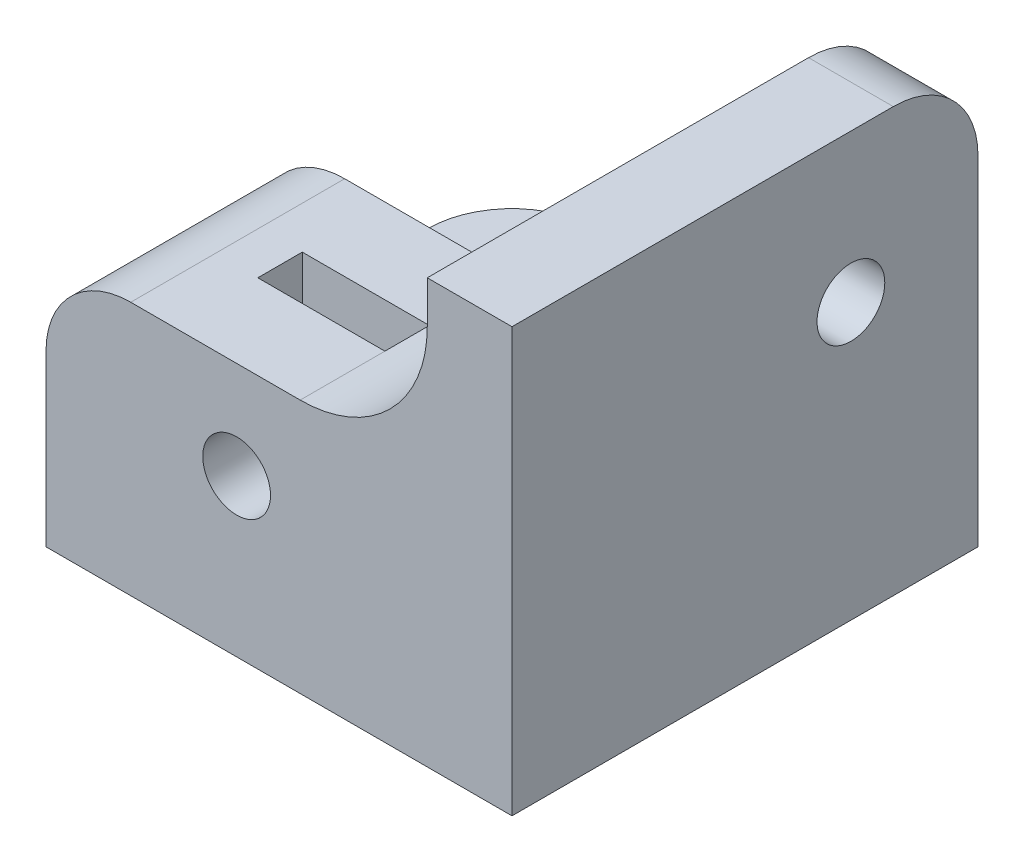
ISO-10303-21;
HEADER;
FILE_DESCRIPTION(('STEP AP214'),'2;1');
FILE_NAME('part.step','',(''),(''),'','','');
FILE_SCHEMA(('AUTOMOTIVE_DESIGN { 1 0 10303 214 1 1 1 1 }'));
ENDSEC;
DATA;
#1=APPLICATION_CONTEXT('core data for automotive mechanical design processes');
#2=APPLICATION_PROTOCOL_DEFINITION('international standard','automotive_design',2000,#1);
#3=PRODUCT_CONTEXT('',#1,'mechanical');
#4=PRODUCT('Part','Part','',(#3));
#5=PRODUCT_RELATED_PRODUCT_CATEGORY('part','',(#4));
#6=PRODUCT_DEFINITION_FORMATION('','',#4);
#7=PRODUCT_DEFINITION_CONTEXT('part definition',#1,'design');
#8=PRODUCT_DEFINITION('design','',#6,#7);
#9=PRODUCT_DEFINITION_SHAPE('','',#8);
#10=(LENGTH_UNIT() NAMED_UNIT(*) SI_UNIT(.MILLI.,.METRE.));
#11=(NAMED_UNIT(*) PLANE_ANGLE_UNIT() SI_UNIT($,.RADIAN.));
#12=(NAMED_UNIT(*) SI_UNIT($,.STERADIAN.) SOLID_ANGLE_UNIT());
#13=UNCERTAINTY_MEASURE_WITH_UNIT(LENGTH_MEASURE(1.E-05),#10,'distance_accuracy_value','');
#14=(GEOMETRIC_REPRESENTATION_CONTEXT(3) GLOBAL_UNCERTAINTY_ASSIGNED_CONTEXT((#13)) GLOBAL_UNIT_ASSIGNED_CONTEXT((#10,
#11,#12)) REPRESENTATION_CONTEXT('',''));
#15=CARTESIAN_POINT('',(0.,0.,0.));
#16=DIRECTION('',(0.,0.,1.));
#17=DIRECTION('',(1.,0.,0.));
#18=AXIS2_PLACEMENT_3D('',#15,#16,#17);
#19=CARTESIAN_POINT('',(0.,4.,0.));
#20=DIRECTION('',(0.,-1.,0.));
#21=DIRECTION('',(0.,0.,-1.));
#22=AXIS2_PLACEMENT_3D('',#19,#20,#21);
#23=PLANE('',#22);
#24=CARTESIAN_POINT('',(0.,4.,-16.));
#25=DIRECTION('',(0.,-1.,0.));
#26=DIRECTION('',(0.,0.,-1.));
#27=AXIS2_PLACEMENT_3D('',#24,#25,#26);
#28=CIRCLE('',#27,1.59999999999999);
#29=CARTESIAN_POINT('',(0.,4.,-17.6));
#30=VERTEX_POINT('',#29);
#31=EDGE_CURVE('E425',#30,#30,#28,.T.);
#32=ORIENTED_EDGE('',*,*,#31,.T.);
#33=EDGE_LOOP('',(#32));
#34=FACE_BOUND('',#33,.T.);
#35=DIRECTION('',(1.,0.,0.));
#36=VECTOR('',#35,1.);
#37=CARTESIAN_POINT('',(-9.,4.,-22.));
#38=LINE('',#37,#36);
#39=CARTESIAN_POINT('',(-5.,4.,-22.));
#40=VERTEX_POINT('',#39);
#41=CARTESIAN_POINT('',(7.,4.,-22.));
#42=VERTEX_POINT('',#41);
#43=EDGE_CURVE('E270',#40,#42,#38,.T.);
#44=ORIENTED_EDGE('',*,*,#43,.F.);
#45=CARTESIAN_POINT('',(-5.,4.,-18.));
#46=DIRECTION('',(0.,-1.,0.));
#47=DIRECTION('',(0.,0.,-1.));
#48=AXIS2_PLACEMENT_3D('',#45,#46,#47);
#49=CIRCLE('',#48,4.);
#50=CARTESIAN_POINT('',(-9.,4.,-18.));
#51=VERTEX_POINT('',#50);
#52=EDGE_CURVE('E552',#40,#51,#49,.F.);
#53=ORIENTED_EDGE('',*,*,#52,.T.);
#54=DIRECTION('',(0.,0.,-1.));
#55=VECTOR('',#54,1.);
#56=CARTESIAN_POINT('',(-9.,4.,0.));
#57=LINE('',#56,#55);
#58=CARTESIAN_POINT('',(-9.,4.,-12.1));
#59=VERTEX_POINT('',#58);
#60=EDGE_CURVE('E272',#59,#51,#57,.T.);
#61=ORIENTED_EDGE('',*,*,#60,.F.);
#62=DIRECTION('',(1.,0.,0.));
#63=VECTOR('',#62,1.);
#64=CARTESIAN_POINT('',(0.,4.,-12.1));
#65=LINE('',#64,#63);
#66=CARTESIAN_POINT('',(-0.774596669241464,4.,-12.1));
#67=VERTEX_POINT('',#66);
#68=EDGE_CURVE('E314',#59,#67,#65,.T.);
#69=ORIENTED_EDGE('',*,*,#68,.T.);
#70=CARTESIAN_POINT('',(-1.82403054502765,4.,-11.9737358820358));
#71=CARTESIAN_POINT('',(-1.11916855956017,4.,-9.5931511936607));
#72=CARTESIAN_POINT('',(-1.26924028677605,6.4258187568914,-10.1));
#73=CARTESIAN_POINT('',(-1.7805962647292,4.,-11.9865987852884));
#74=CARTESIAN_POINT('',(-1.12319882462948,4.,-9.61165368428019));
#75=CARTESIAN_POINT('',(-1.25803042539635,6.41122501067544,-10.1));
#76=CARTESIAN_POINT('',(-1.73683147683627,4.,-11.9983010068458));
#77=CARTESIAN_POINT('',(-1.12522502092348,4.,-9.63126718829636));
#78=CARTESIAN_POINT('',(-1.24599129473774,6.39604796219209,-10.1));
#79=CARTESIAN_POINT('',(-1.64879461728343,4.,-12.0195073290176));
#80=CARTESIAN_POINT('',(-1.12477736231327,4.,-9.67212059622376));
#81=CARTESIAN_POINT('',(-1.21994921637539,6.3645557075126,-10.1));
#82=CARTESIAN_POINT('',(-1.60452281299412,4.,-12.0290125368223));
#83=CARTESIAN_POINT('',(-1.12234918412667,4.,-9.69333240042049));
#84=CARTESIAN_POINT('',(-1.20594726358126,6.34824108002186,-10.1));
#85=CARTESIAN_POINT('',(-1.47161685387063,4.,-12.0543385221081));
#86=CARTESIAN_POINT('',(-1.10793883131886,4.,-9.75817281588815));
#87=CARTESIAN_POINT('',(-1.16069400629172,6.29780248330647,-10.1));
#88=CARTESIAN_POINT('',(-1.3823951858914,4.,-12.0671128740153));
#89=CARTESIAN_POINT('',(-1.08904262653254,4.,-9.80374027226861));
#90=CARTESIAN_POINT('',(-1.1260747493061,6.26201728962933,-10.1));
#91=CARTESIAN_POINT('',(-1.20354018076542,4.,-12.0858788087633));
#92=CARTESIAN_POINT('',(-1.03019458592267,4.,-9.8952387391543));
#93=CARTESIAN_POINT('',(-1.04501989411058,6.18716411710102,-10.1));
#94=CARTESIAN_POINT('',(-1.11390856833941,4.,-12.0918883311378));
#95=CARTESIAN_POINT('',(-0.990769447022097,4.,-9.9411013548777));
#96=CARTESIAN_POINT('',(-0.998615950435424,6.14810511732633,-10.1));
#97=CARTESIAN_POINT('',(-0.934335256386393,4.,-12.0990432571167));
#98=CARTESIAN_POINT('',(-0.890458114233356,4.,-10.0287587398444));
#99=CARTESIAN_POINT('',(-0.890693589209525,6.06916194350224,-10.1));
#100=CARTESIAN_POINT('',(-0.844393289060077,4.,-12.1001805522571));
#101=CARTESIAN_POINT('',(-0.829959676968108,4.,-10.0706447593568));
#102=CARTESIAN_POINT('',(-0.829150156000375,6.02927650480771,-10.1));
#103=CARTESIAN_POINT('',(-0.68417531468098,4.,-12.0998174111304));
#104=CARTESIAN_POINT('',(-0.70449964018734,4.,-10.1375215802198));
#105=CARTESIAN_POINT('',(-0.704244768000008,5.96198426509438,-10.1));
#106=CARTESIAN_POINT('',(-0.61389347887839,4.,-12.0988387114327));
#107=CARTESIAN_POINT('',(-0.643696928848112,4.,-10.1642406303779));
#108=CARTESIAN_POINT('',(-0.644214216250097,5.93375438457379,-10.1));
#109=CARTESIAN_POINT('',(-0.473336442837148,4.,-12.0963404894999));
#110=CARTESIAN_POINT('',(-0.512280258296524,4.,-10.2102750758347));
#111=CARTESIAN_POINT('',(-0.514078444544596,5.8832340314612,-10.1));
#112=CARTESIAN_POINT('',(-0.403061243209818,4.,-12.094820936266));
#113=CARTESIAN_POINT('',(-0.441583710112524,4.,-10.2297482576342));
#114=CARTESIAN_POINT('',(-0.443972647269282,5.86094389943063,-10.1));
#115=CARTESIAN_POINT('',(-0.262546385903844,4.,-12.0921995954244));
#116=CARTESIAN_POINT('',(-0.293682144602031,4.,-10.259683107964));
#117=CARTESIAN_POINT('',(-0.296098646974846,5.82581108686526,-10.1));
#118=CARTESIAN_POINT('',(-0.192306733970038,4.,-12.0910975433243));
#119=CARTESIAN_POINT('',(-0.216206561759959,4.,-10.2702895438889));
#120=CARTESIAN_POINT('',(-0.218335334567638,5.81296242017744,-10.1));
#121=CARTESIAN_POINT('',(-0.0518221375182659,4.,-12.0899054925689));
#122=CARTESIAN_POINT('',(-0.0590012772093506,4.,-10.2816268542113));
#123=CARTESIAN_POINT('',(-0.0596146154382456,5.79913171121381,-10.1));
#124=CARTESIAN_POINT('',(0.0184228062410561,4.,-12.0898154201712));
#125=CARTESIAN_POINT('',(0.0211458173145249,4.,-10.2824201453904));
#126=CARTESIAN_POINT('',(0.0213425581176015,5.7981488042862,-10.1));
#127=CARTESIAN_POINT('',(0.159124889773288,4.,-12.0906954956601));
#128=CARTESIAN_POINT('',(0.179305484522144,4.,-10.2741523030525));
#129=CARTESIAN_POINT('',(0.181162356082325,5.80826514316956,-10.1));
#130=CARTESIAN_POINT('',(0.229582004331244,4.,-12.0916689685307));
#131=CARTESIAN_POINT('',(0.257742921830697,4.,-10.26501444169));
#132=CARTESIAN_POINT('',(0.260017617657972,5.81940227970312,-10.1));
#133=CARTESIAN_POINT('',(0.370488515710523,4.,-12.0941585369611));
#134=CARTESIAN_POINT('',(0.408028219727147,4.,-10.2377620654838));
#135=CARTESIAN_POINT('',(0.410550810953601,5.85164614105061,-10.1));
#136=CARTESIAN_POINT('',(0.440937911950934,4.,-12.0956746603392));
#137=CARTESIAN_POINT('',(0.480181367670186,4.,-10.2195152304163));
#138=CARTESIAN_POINT('',(0.482228374474775,5.87275337698969,-10.1));
#139=CARTESIAN_POINT('',(0.546675605049802,4.,-12.0976621251865));
#140=CARTESIAN_POINT('',(0.580953010209002,4.,-10.1866720838678));
#141=CARTESIAN_POINT('',(0.582394418500208,5.90933104861359,-10.1));
#142=CARTESIAN_POINT('',(0.581960942654905,4.,-12.0982772115942));
#143=CARTESIAN_POINT('',(0.61349166583243,4.,-10.1747233104541));
#144=CARTESIAN_POINT('',(0.614581322532975,5.92235572553775,-10.1));
#145=CARTESIAN_POINT('',(0.652534065326207,4.,-12.0992741997881));
#146=CARTESIAN_POINT('',(0.675912309475973,4.,-10.149190201474));
#147=CARTESIAN_POINT('',(0.676367797489094,5.94959878818868,-10.1));
#148=CARTESIAN_POINT('',(0.687821850285611,4.,-12.0996561086517));
#149=CARTESIAN_POINT('',(0.705796980087803,4.,-10.1355867643772));
#150=CARTESIAN_POINT('',(0.705967446916304,5.9638171376707,-10.1));
#151=CARTESIAN_POINT('',(0.758403380733734,4.,-12.1000491084595));
#152=CARTESIAN_POINT('',(0.762681123212899,4.,-10.1069920135739));
#153=CARTESIAN_POINT('',(0.762542913337349,5.99303718856448,-10.1));
#154=CARTESIAN_POINT('',(0.793697126473347,4.,-12.1000601663082));
#155=CARTESIAN_POINT('',(0.789672647649024,4.,-10.0919837742736));
#156=CARTESIAN_POINT('',(0.789518495939816,6.00803895977077,-10.1));
#157=CARTESIAN_POINT('',(0.864284750481954,4.,-12.0995745119406));
#158=CARTESIAN_POINT('',(0.840637325279477,4.,-10.0608369968989));
#159=CARTESIAN_POINT('',(0.840919373535417,6.03847736438699,-10.1));
#160=CARTESIAN_POINT('',(0.899578628322743,4.,-12.0990777428328));
#161=CARTESIAN_POINT('',(0.864594567590907,4.,-10.0446847610148));
#162=CARTESIAN_POINT('',(0.865344382451381,6.05391404633131,-10.1));
#163=CARTESIAN_POINT('',(0.934867277113493,4.,-12.0982586017961));
#164=CARTESIAN_POINT('',(0.886863816660147,4.,-10.0281755910972));
#165=CARTESIAN_POINT('',(0.888529363478575,6.06939278138275,-10.1));
#166=(BOUNDED_SURFACE() B_SPLINE_SURFACE(3,2,((#70,#71,#72),(#73,#74,#75),(#76,#77,#78),(#79,
#80,#81),(#82,#83,#84),(#85,#86,#87),(#88,#89,#90),(#91,#92,#93),(#94,#95,#96),(#97,#98,#99),
(#100,#101,#102),(#103,#104,#105),(#106,#107,#108),(#109,#110,#111),(#112,#113,#114),(#115,#116,
#117),(#118,#119,#120),(#121,#122,#123),(#124,#125,#126),(#127,#128,#129),(#130,#131,#132),
(#133,#134,#135),(#136,#137,#138),(#139,#140,#141),(#142,#143,#144),(#145,#146,#147),(#148,#149,
#150),(#151,#152,#153),(#154,#155,#156),(#157,#158,#159),(#160,#161,#162),(#163,#164,#165)),
.UNSPECIFIED.,.F.,.F.,.F.) B_SPLINE_SURFACE_WITH_KNOTS((4,2,2,2,2,2,2,2,2,2,2,2,2,2,2,4),(3,3),
(0.,0.135860025595234,0.271651434195088,0.541689204437421,0.811009166671835,1.08077716321527,
1.29164000466544,1.50251493354816,1.71325604619527,1.92398180215339,2.13536824460499,
2.34676552512857,2.45263721715464,2.55850569564945,2.66438362204207,2.7702734111766),(0.,1.),
.UNSPECIFIED.) GEOMETRIC_REPRESENTATION_ITEM() RATIONAL_B_SPLINE_SURFACE(((1.,0.627331898421521,
1.),(1.,0.630239753387599,1.),(1.,0.633243666990151,1.),(1.,0.639429961679208,1.),(1.,
0.642612251863298,1.),(1.,0.652373628643953,1.),(1.,0.659200577201497,1.),(1.,0.673244280382799,
1.),(1.,0.680459950594755,1.),(1.,0.694809647576501,1.),(1.,0.701943518556926,1.),(1.,
0.713814753239371,1.),(1.,0.718735271219481,1.),(1.,0.727468653540723,1.),(1.,0.731281454370911,
1.),(1.,0.737262895090711,1.),(1.,0.73943257679055,1.),(1.,0.741767252493318,1.),(1.,
0.741932392566166,1.),(1.,0.740225839653361,1.),(1.,0.738347758980718,1.),(1.,0.732867993236564,
1.),(1.,0.729266219798437,1.),(1.,0.722960379740411,1.),(1.,0.72070569191067,1.),(1.,
0.715965023019241,1.),(1.,0.71347904898009,1.),(1.,0.708341205790352,1.),(1.,0.705689321854779,
1.),(1.,0.700277191956183,1.),(1.,0.697516933885385,1.),(1.,0.694731462260284,1.))) REPRESENTATION_ITEM('') SURFACE());
#167=CARTESIAN_POINT('',(-1.82403054502765,4.,-11.9737358820358));
#168=CARTESIAN_POINT('',(-1.7805962647292,4.,-11.9865987852884));
#169=CARTESIAN_POINT('',(-1.73683147683627,4.,-11.9983010068458));
#170=CARTESIAN_POINT('',(-1.64879461728343,4.,-12.0195073290176));
#171=CARTESIAN_POINT('',(-1.60452281299412,4.,-12.0290125368223));
#172=CARTESIAN_POINT('',(-1.47161685387063,4.,-12.0543385221081));
#173=CARTESIAN_POINT('',(-1.3823951858914,4.,-12.0671128740153));
#174=CARTESIAN_POINT('',(-1.20354018076542,4.,-12.0858788087633));
#175=CARTESIAN_POINT('',(-1.11390856833941,4.,-12.0918883311378));
#176=CARTESIAN_POINT('',(-0.934335256386393,4.,-12.0990432571167));
#177=CARTESIAN_POINT('',(-0.844393289060077,4.,-12.1001805522571));
#178=CARTESIAN_POINT('',(-0.68417531468098,4.,-12.0998174111304));
#179=CARTESIAN_POINT('',(-0.61389347887839,4.,-12.0988387114327));
#180=CARTESIAN_POINT('',(-0.473336442837148,4.,-12.0963404894999));
#181=CARTESIAN_POINT('',(-0.403061243209818,4.,-12.094820936266));
#182=CARTESIAN_POINT('',(-0.262546385903844,4.,-12.0921995954244));
#183=CARTESIAN_POINT('',(-0.192306733970038,4.,-12.0910975433243));
#184=CARTESIAN_POINT('',(-0.0518221375182659,4.,-12.0899054925689));
#185=CARTESIAN_POINT('',(0.0184228062410561,4.,-12.0898154201712));
#186=CARTESIAN_POINT('',(0.159124889773288,4.,-12.0906954956601));
#187=CARTESIAN_POINT('',(0.229582004331243,4.,-12.0916689685307));
#188=CARTESIAN_POINT('',(0.370488515710523,4.,-12.0941585369611));
#189=CARTESIAN_POINT('',(0.440937911950934,4.,-12.0956746603392));
#190=CARTESIAN_POINT('',(0.546675605049802,4.,-12.0976621251865));
#191=CARTESIAN_POINT('',(0.581960942654905,4.,-12.0982772115942));
#192=CARTESIAN_POINT('',(0.652534065326208,4.,-12.0992741997881));
#193=CARTESIAN_POINT('',(0.687821850285611,4.,-12.0996561086517));
#194=CARTESIAN_POINT('',(0.758403380733734,4.,-12.1000491084595));
#195=CARTESIAN_POINT('',(0.793697126473347,4.,-12.1000601663082));
#196=CARTESIAN_POINT('',(0.864284750481954,4.,-12.0995745119406));
#197=CARTESIAN_POINT('',(0.899578628322743,4.,-12.0990777428328));
#198=CARTESIAN_POINT('',(0.934867277113493,4.,-12.0982586017961));
#199=B_SPLINE_CURVE_WITH_KNOTS('',3,(#167,#168,#169,#170,#171,#172,#173,#174,#175,#176,#177,
#178,#179,#180,#181,#182,#183,#184,#185,#186,#187,#188,#189,#190,#191,#192,#193,#194,#195,#196,
#197,#198),.UNSPECIFIED.,.F.,.F.,(4,2,2,2,2,2,2,2,2,2,2,2,2,2,2,4),(0.,0.135860025595234,
0.271651434195088,0.541689204437421,0.811009166671835,1.08077716321527,1.29164000466544,
1.50251493354816,1.71325604619527,1.92398180215339,2.13536824460499,2.34676552512857,
2.45263721715464,2.55850569564945,2.66438362204207,2.7702734111766),.UNSPECIFIED.);
#200=CARTESIAN_POINT('',(0.774596669241464,4.,-12.1));
#201=VERTEX_POINT('',#200);
#202=EDGE_CURVE('E306',#67,#201,#199,.T.);
#203=ORIENTED_EDGE('',*,*,#202,.T.);
#204=DIRECTION('',(1.,0.,0.));
#205=VECTOR('',#204,1.);
#206=CARTESIAN_POINT('',(0.,4.,-12.1));
#207=LINE('',#206,#205);
#208=CARTESIAN_POINT('',(7.,4.,-12.1));
#209=VERTEX_POINT('',#208);
#210=EDGE_CURVE('E304',#201,#209,#207,.T.);
#211=ORIENTED_EDGE('',*,*,#210,.T.);
#212=DIRECTION('',(0.,0.,-1.));
#213=VECTOR('',#212,1.);
#214=CARTESIAN_POINT('',(7.,4.,0.));
#215=LINE('',#214,#213);
#216=EDGE_CURVE('E570',#209,#42,#215,.T.);
#217=ORIENTED_EDGE('',*,*,#216,.T.);
#218=EDGE_LOOP('',(#44,#53,#61,#69,#203,#211,#217));
#219=FACE_BOUND('',#218,.T.);
#220=ADVANCED_FACE('F60',(#34,#219),#23,.F.);
#221=CARTESIAN_POINT('',(-9.,4.,-22.));
#222=DIRECTION('',(0.,0.,-1.));
#223=DIRECTION('',(-1.,0.,0.));
#224=AXIS2_PLACEMENT_3D('',#221,#222,#223);
#225=PLANE('',#224);
#226=DIRECTION('',(1.,0.,0.));
#227=VECTOR('',#226,1.);
#228=CARTESIAN_POINT('',(-9.,0.,-22.));
#229=LINE('',#228,#227);
#230=CARTESIAN_POINT('',(-5.,0.,-22.));
#231=VERTEX_POINT('',#230);
#232=CARTESIAN_POINT('',(13.,0.,-22.));
#233=VERTEX_POINT('',#232);
#234=EDGE_CURVE('E210',#231,#233,#229,.T.);
#235=ORIENTED_EDGE('',*,*,#234,.F.);
#236=DIRECTION('',(0.,-1.,0.));
#237=VECTOR('',#236,1.);
#238=CARTESIAN_POINT('',(-5.,4.,-22.));
#239=LINE('',#238,#237);
#240=EDGE_CURVE('E550',#231,#40,#239,.F.);
#241=ORIENTED_EDGE('',*,*,#240,.T.);
#242=ORIENTED_EDGE('',*,*,#43,.T.);
#243=CARTESIAN_POINT('',(7.,6.,-22.));
#244=DIRECTION('',(0.,0.,-1.));
#245=DIRECTION('',(-1.,0.,0.));
#246=AXIS2_PLACEMENT_3D('',#243,#244,#245);
#247=CIRCLE('',#246,2.);
#248=CARTESIAN_POINT('',(9.,6.,-22.));
#249=VERTEX_POINT('',#248);
#250=EDGE_CURVE('E501',#42,#249,#247,.F.);
#251=ORIENTED_EDGE('',*,*,#250,.T.);
#252=DIRECTION('',(0.,-1.,0.));
#253=VECTOR('',#252,1.);
#254=CARTESIAN_POINT('',(9.,20.,-22.));
#255=LINE('',#254,#253);
#256=CARTESIAN_POINT('',(9.,16.,-22.));
#257=VERTEX_POINT('',#256);
#258=EDGE_CURVE('E229',#257,#249,#255,.T.);
#259=ORIENTED_EDGE('',*,*,#258,.F.);
#260=DIRECTION('',(1.,0.,0.));
#261=VECTOR('',#260,1.);
#262=CARTESIAN_POINT('',(-9.,16.,-22.));
#263=LINE('',#262,#261);
#264=CARTESIAN_POINT('',(13.,16.,-22.));
#265=VERTEX_POINT('',#264);
#266=EDGE_CURVE('E547',#257,#265,#263,.T.);
#267=ORIENTED_EDGE('',*,*,#266,.T.);
#268=DIRECTION('',(0.,-1.,0.));
#269=VECTOR('',#268,1.);
#270=CARTESIAN_POINT('',(13.,4.,-22.));
#271=LINE('',#270,#269);
#272=EDGE_CURVE('E211',#265,#233,#271,.T.);
#273=ORIENTED_EDGE('',*,*,#272,.T.);
#274=EDGE_LOOP('',(#235,#241,#242,#251,#259,#267,#273));
#275=FACE_BOUND('',#274,.T.);
#276=ADVANCED_FACE('F374',(#275),#225,.T.);
#277=CARTESIAN_POINT('',(-9.,4.,0.));
#278=DIRECTION('',(-1.,0.,0.));
#279=DIRECTION('',(0.,0.,1.));
#280=AXIS2_PLACEMENT_3D('',#277,#278,#279);
#281=PLANE('',#280);
#282=DIRECTION('',(0.,-1.,0.));
#283=VECTOR('',#282,1.);
#284=CARTESIAN_POINT('',(-9.,4.,0.));
#285=LINE('',#284,#283);
#286=CARTESIAN_POINT('',(-9.,8.,0.));
#287=VERTEX_POINT('',#286);
#288=CARTESIAN_POINT('',(-9.,0.,0.));
#289=VERTEX_POINT('',#288);
#290=EDGE_CURVE('E275',#287,#289,#285,.T.);
#291=ORIENTED_EDGE('',*,*,#290,.F.);
#292=DIRECTION('',(0.,0.,-1.));
#293=VECTOR('',#292,1.);
#294=CARTESIAN_POINT('',(-9.,8.,0.));
#295=LINE('',#294,#293);
#296=CARTESIAN_POINT('',(-9.,8.,-10.1));
#297=VERTEX_POINT('',#296);
#298=EDGE_CURVE('E535',#287,#297,#295,.T.);
#299=ORIENTED_EDGE('',*,*,#298,.T.);
#300=DIRECTION('',(0.,-1.,0.));
#301=VECTOR('',#300,1.);
#302=CARTESIAN_POINT('',(-9.,12.,-10.1));
#303=LINE('',#302,#301);
#304=CARTESIAN_POINT('',(-9.,6.,-10.1));
#305=VERTEX_POINT('',#304);
#306=EDGE_CURVE('E246',#297,#305,#303,.T.);
#307=ORIENTED_EDGE('',*,*,#306,.T.);
#308=CARTESIAN_POINT('',(-9.,6.,-12.1));
#309=DIRECTION('',(-1.,0.,0.));
#310=DIRECTION('',(0.,0.,1.));
#311=AXIS2_PLACEMENT_3D('',#308,#309,#310);
#312=CIRCLE('',#311,2.);
#313=EDGE_CURVE('E504',#305,#59,#312,.F.);
#314=ORIENTED_EDGE('',*,*,#313,.T.);
#315=ORIENTED_EDGE('',*,*,#60,.T.);
#316=DIRECTION('',(0.,-1.,0.));
#317=VECTOR('',#316,1.);
#318=CARTESIAN_POINT('',(-9.,4.,-18.));
#319=LINE('',#318,#317);
#320=CARTESIAN_POINT('',(-9.,0.,-18.));
#321=VERTEX_POINT('',#320);
#322=EDGE_CURVE('E354',#51,#321,#319,.T.);
#323=ORIENTED_EDGE('',*,*,#322,.T.);
#324=DIRECTION('',(0.,0.,-1.));
#325=VECTOR('',#324,1.);
#326=CARTESIAN_POINT('',(-9.,0.,0.));
#327=LINE('',#326,#325);
#328=EDGE_CURVE('E278',#289,#321,#327,.T.);
#329=ORIENTED_EDGE('',*,*,#328,.F.);
#330=EDGE_LOOP('',(#291,#299,#307,#314,#315,#323,#329));
#331=FACE_BOUND('',#330,.T.);
#332=ADVANCED_FACE('F379',(#331),#281,.T.);
#333=CARTESIAN_POINT('',(-9.,4.,0.));
#334=DIRECTION('',(0.,0.,-1.));
#335=DIRECTION('',(-1.,0.,0.));
#336=AXIS2_PLACEMENT_3D('',#333,#334,#335);
#337=PLANE('',#336);
#338=CARTESIAN_POINT('',(0.,7.4,0.));
#339=DIRECTION('',(0.,0.,1.));
#340=DIRECTION('',(1.,0.,0.));
#341=AXIS2_PLACEMENT_3D('',#338,#339,#340);
#342=CIRCLE('',#341,1.59999999999999);
#343=CARTESIAN_POINT('',(1.59999999999999,7.4,0.));
#344=VERTEX_POINT('',#343);
#345=EDGE_CURVE('E410',#344,#344,#342,.T.);
#346=ORIENTED_EDGE('',*,*,#345,.F.);
#347=EDGE_LOOP('',(#346));
#348=FACE_BOUND('',#347,.T.);
#349=DIRECTION('',(1.,0.,0.));
#350=VECTOR('',#349,1.);
#351=CARTESIAN_POINT('',(0.,12.,0.));
#352=LINE('',#351,#350);
#353=CARTESIAN_POINT('',(-5.,12.,0.));
#354=VERTEX_POINT('',#353);
#355=CARTESIAN_POINT('',(3.,12.,0.));
#356=VERTEX_POINT('',#355);
#357=EDGE_CURVE('E241',#354,#356,#352,.T.);
#358=ORIENTED_EDGE('',*,*,#357,.F.);
#359=CARTESIAN_POINT('',(-5.,8.,0.));
#360=DIRECTION('',(0.,0.,-1.));
#361=DIRECTION('',(-1.,0.,0.));
#362=AXIS2_PLACEMENT_3D('',#359,#360,#361);
#363=CIRCLE('',#362,4.);
#364=EDGE_CURVE('E543',#354,#287,#363,.F.);
#365=ORIENTED_EDGE('',*,*,#364,.T.);
#366=ORIENTED_EDGE('',*,*,#290,.T.);
#367=DIRECTION('',(1.,0.,0.));
#368=VECTOR('',#367,1.);
#369=CARTESIAN_POINT('',(-9.,0.,0.));
#370=LINE('',#369,#368);
#371=CARTESIAN_POINT('',(13.,0.,0.));
#372=VERTEX_POINT('',#371);
#373=EDGE_CURVE('E207',#289,#372,#370,.T.);
#374=ORIENTED_EDGE('',*,*,#373,.T.);
#375=DIRECTION('',(0.,-1.,0.));
#376=VECTOR('',#375,1.);
#377=CARTESIAN_POINT('',(13.,4.,0.));
#378=LINE('',#377,#376);
#379=CARTESIAN_POINT('',(13.,20.,0.));
#380=VERTEX_POINT('',#379);
#381=EDGE_CURVE('E200',#380,#372,#378,.T.);
#382=ORIENTED_EDGE('',*,*,#381,.F.);
#383=DIRECTION('',(1.,0.,0.));
#384=VECTOR('',#383,1.);
#385=CARTESIAN_POINT('',(0.,20.,0.));
#386=LINE('',#385,#384);
#387=CARTESIAN_POINT('',(9.,20.,0.));
#388=VERTEX_POINT('',#387);
#389=EDGE_CURVE('E205',#388,#380,#386,.T.);
#390=ORIENTED_EDGE('',*,*,#389,.F.);
#391=DIRECTION('',(0.,-1.,0.));
#392=VECTOR('',#391,1.);
#393=CARTESIAN_POINT('',(9.,20.,0.));
#394=LINE('',#393,#392);
#395=CARTESIAN_POINT('',(9.,18.,0.));
#396=VERTEX_POINT('',#395);
#397=EDGE_CURVE('E227',#388,#396,#394,.T.);
#398=ORIENTED_EDGE('',*,*,#397,.T.);
#399=CARTESIAN_POINT('',(3.,18.,0.));
#400=DIRECTION('',(0.,0.,-1.));
#401=DIRECTION('',(-1.,0.,0.));
#402=AXIS2_PLACEMENT_3D('',#399,#400,#401);
#403=CIRCLE('',#402,6.);
#404=EDGE_CURVE('E301',#396,#356,#403,.T.);
#405=ORIENTED_EDGE('',*,*,#404,.T.);
#406=EDGE_LOOP('',(#358,#365,#366,#374,#382,#390,#398,#405));
#407=FACE_BOUND('',#406,.T.);
#408=ADVANCED_FACE('F202',(#348,#407),#337,.F.);
#409=CARTESIAN_POINT('',(0.,0.,0.));
#410=DIRECTION('',(0.,-1.,0.));
#411=DIRECTION('',(0.,0.,-1.));
#412=AXIS2_PLACEMENT_3D('',#409,#410,#411);
#413=PLANE('',#412);
#414=CARTESIAN_POINT('',(0.,0.,-16.));
#415=DIRECTION('',(0.,-1.,0.));
#416=DIRECTION('',(0.,0.,-1.));
#417=AXIS2_PLACEMENT_3D('',#414,#415,#416);
#418=CIRCLE('',#417,1.59999999999999);
#419=CARTESIAN_POINT('',(0.,0.,-17.6));
#420=VERTEX_POINT('',#419);
#421=EDGE_CURVE('E423',#420,#420,#418,.T.);
#422=ORIENTED_EDGE('',*,*,#421,.F.);
#423=EDGE_LOOP('',(#422));
#424=FACE_BOUND('',#423,.T.);
#425=ORIENTED_EDGE('',*,*,#328,.T.);
#426=CARTESIAN_POINT('',(-5.,0.,-18.));
#427=DIRECTION('',(0.,-1.,0.));
#428=DIRECTION('',(0.,0.,-1.));
#429=AXIS2_PLACEMENT_3D('',#426,#427,#428);
#430=CIRCLE('',#429,4.);
#431=EDGE_CURVE('E545',#321,#231,#430,.T.);
#432=ORIENTED_EDGE('',*,*,#431,.T.);
#433=ORIENTED_EDGE('',*,*,#234,.T.);
#434=DIRECTION('',(0.,0.,-1.));
#435=VECTOR('',#434,1.);
#436=CARTESIAN_POINT('',(13.,0.,0.));
#437=LINE('',#436,#435);
#438=EDGE_CURVE('E269',#372,#233,#437,.T.);
#439=ORIENTED_EDGE('',*,*,#438,.F.);
#440=ORIENTED_EDGE('',*,*,#373,.F.);
#441=EDGE_LOOP('',(#425,#432,#433,#439,#440));
#442=FACE_BOUND('',#441,.T.);
#443=ADVANCED_FACE('F390',(#424,#442),#413,.T.);
#444=CARTESIAN_POINT('',(13.,4.,0.));
#445=DIRECTION('',(-1.,0.,0.));
#446=DIRECTION('',(0.,0.,1.));
#447=AXIS2_PLACEMENT_3D('',#444,#445,#446);
#448=PLANE('',#447);
#449=CARTESIAN_POINT('',(13.,13.,-16.));
#450=DIRECTION('',(1.,0.,0.));
#451=DIRECTION('',(0.,0.,-1.));
#452=AXIS2_PLACEMENT_3D('',#449,#450,#451);
#453=CIRCLE('',#452,1.59999999999999);
#454=CARTESIAN_POINT('',(13.,13.,-17.6));
#455=VERTEX_POINT('',#454);
#456=EDGE_CURVE('E221',#455,#455,#453,.T.);
#457=ORIENTED_EDGE('',*,*,#456,.F.);
#458=EDGE_LOOP('',(#457));
#459=FACE_BOUND('',#458,.T.);
#460=ORIENTED_EDGE('',*,*,#272,.F.);
#461=CARTESIAN_POINT('',(13.,16.,-18.));
#462=DIRECTION('',(-1.,0.,0.));
#463=DIRECTION('',(0.,0.,1.));
#464=AXIS2_PLACEMENT_3D('',#461,#462,#463);
#465=CIRCLE('',#464,4.);
#466=CARTESIAN_POINT('',(13.,20.,-18.));
#467=VERTEX_POINT('',#466);
#468=EDGE_CURVE('E82',#265,#467,#465,.F.);
#469=ORIENTED_EDGE('',*,*,#468,.T.);
#470=DIRECTION('',(0.,0.,-1.));
#471=VECTOR('',#470,1.);
#472=CARTESIAN_POINT('',(13.,20.,0.));
#473=LINE('',#472,#471);
#474=EDGE_CURVE('E213',#380,#467,#473,.T.);
#475=ORIENTED_EDGE('',*,*,#474,.F.);
#476=ORIENTED_EDGE('',*,*,#381,.T.);
#477=ORIENTED_EDGE('',*,*,#438,.T.);
#478=EDGE_LOOP('',(#460,#469,#475,#476,#477));
#479=FACE_BOUND('',#478,.T.);
#480=ADVANCED_FACE('F214',(#459,#479),#448,.F.);
#481=CARTESIAN_POINT('',(0.,12.,-10.1));
#482=DIRECTION('',(0.,0.,-1.));
#483=DIRECTION('',(-1.,0.,0.));
#484=AXIS2_PLACEMENT_3D('',#481,#482,#483);
#485=PLANE('',#484);
#486=ORIENTED_EDGE('',*,*,#306,.F.);
#487=CARTESIAN_POINT('',(-5.,8.,-10.1));
#488=DIRECTION('',(0.,0.,-1.));
#489=DIRECTION('',(-1.,0.,0.));
#490=AXIS2_PLACEMENT_3D('',#487,#488,#489);
#491=CIRCLE('',#490,4.);
#492=CARTESIAN_POINT('',(-5.,12.,-10.1));
#493=VERTEX_POINT('',#492);
#494=EDGE_CURVE('E530',#297,#493,#491,.T.);
#495=ORIENTED_EDGE('',*,*,#494,.T.);
#496=DIRECTION('',(1.,0.,0.));
#497=VECTOR('',#496,1.);
#498=CARTESIAN_POINT('',(0.,12.,-10.1));
#499=LINE('',#498,#497);
#500=CARTESIAN_POINT('',(3.,12.,-10.1));
#501=VERTEX_POINT('',#500);
#502=EDGE_CURVE('E243',#493,#501,#499,.T.);
#503=ORIENTED_EDGE('',*,*,#502,.T.);
#504=CARTESIAN_POINT('',(3.,18.,-10.1));
#505=DIRECTION('',(0.,0.,-1.));
#506=DIRECTION('',(-1.,0.,0.));
#507=AXIS2_PLACEMENT_3D('',#504,#505,#506);
#508=CIRCLE('',#507,6.);
#509=CARTESIAN_POINT('',(7.,13.5278640450004,-10.1));
#510=VERTEX_POINT('',#509);
#511=EDGE_CURVE('E298',#501,#510,#508,.F.);
#512=ORIENTED_EDGE('',*,*,#511,.T.);
#513=DIRECTION('',(0.,-1.,0.));
#514=VECTOR('',#513,1.);
#515=CARTESIAN_POINT('',(7.,4.,-10.1));
#516=LINE('',#515,#514);
#517=CARTESIAN_POINT('',(7.,6.,-10.1));
#518=VERTEX_POINT('',#517);
#519=EDGE_CURVE('E482',#510,#518,#516,.T.);
#520=ORIENTED_EDGE('',*,*,#519,.T.);
#521=DIRECTION('',(1.,0.,0.));
#522=VECTOR('',#521,1.);
#523=CARTESIAN_POINT('',(0.,6.,-10.1));
#524=LINE('',#523,#522);
#525=CARTESIAN_POINT('',(0.774596669241464,6.,-10.1));
#526=VERTEX_POINT('',#525);
#527=EDGE_CURVE('E490',#518,#526,#524,.F.);
#528=ORIENTED_EDGE('',*,*,#527,.T.);
#529=CARTESIAN_POINT('',(0.,7.4,-10.1));
#530=DIRECTION('',(0.,0.,-1.));
#531=DIRECTION('',(-1.,0.,0.));
#532=AXIS2_PLACEMENT_3D('',#529,#530,#531);
#533=CIRCLE('',#532,1.59999999999999);
#534=CARTESIAN_POINT('',(-0.774596669241464,6.,-10.1));
#535=VERTEX_POINT('',#534);
#536=EDGE_CURVE('E290',#535,#526,#533,.T.);
#537=ORIENTED_EDGE('',*,*,#536,.F.);
#538=DIRECTION('',(1.,0.,0.));
#539=VECTOR('',#538,1.);
#540=CARTESIAN_POINT('',(0.,6.,-10.1));
#541=LINE('',#540,#539);
#542=EDGE_CURVE('E493',#535,#305,#541,.F.);
#543=ORIENTED_EDGE('',*,*,#542,.T.);
#544=EDGE_LOOP('',(#486,#495,#503,#512,#520,#528,#537,#543));
#545=FACE_BOUND('',#544,.T.);
#546=ADVANCED_FACE('F389',(#545),#485,.T.);
#547=CARTESIAN_POINT('',(-3.,12.,0.));
#548=DIRECTION('',(1.,0.,0.));
#549=DIRECTION('',(0.,0.,-1.));
#550=AXIS2_PLACEMENT_3D('',#547,#548,#549);
#551=PLANE('',#550);
#552=DIRECTION('',(0.,0.,1.));
#553=VECTOR('',#552,1.);
#554=CARTESIAN_POINT('',(-3.,4.,0.));
#555=LINE('',#554,#553);
#556=CARTESIAN_POINT('',(-3.,4.,-6.1));
#557=VERTEX_POINT('',#556);
#558=CARTESIAN_POINT('',(-3.,4.,-4.));
#559=VERTEX_POINT('',#558);
#560=EDGE_CURVE('E267',#557,#559,#555,.T.);
#561=ORIENTED_EDGE('',*,*,#560,.F.);
#562=DIRECTION('',(0.,-1.,0.));
#563=VECTOR('',#562,1.);
#564=CARTESIAN_POINT('',(-3.,12.,-6.1));
#565=LINE('',#564,#563);
#566=CARTESIAN_POINT('',(-3.,12.,-6.1));
#567=VERTEX_POINT('',#566);
#568=EDGE_CURVE('E249',#567,#557,#565,.T.);
#569=ORIENTED_EDGE('',*,*,#568,.F.);
#570=DIRECTION('',(0.,0.,1.));
#571=VECTOR('',#570,1.);
#572=CARTESIAN_POINT('',(-3.,12.,0.));
#573=LINE('',#572,#571);
#574=CARTESIAN_POINT('',(-3.,12.,-4.));
#575=VERTEX_POINT('',#574);
#576=EDGE_CURVE('E231',#567,#575,#573,.T.);
#577=ORIENTED_EDGE('',*,*,#576,.T.);
#578=DIRECTION('',(0.,-1.,0.));
#579=VECTOR('',#578,1.);
#580=CARTESIAN_POINT('',(-3.,12.,-4.));
#581=LINE('',#580,#579);
#582=EDGE_CURVE('E245',#575,#559,#581,.T.);
#583=ORIENTED_EDGE('',*,*,#582,.T.);
#584=EDGE_LOOP('',(#561,#569,#577,#583));
#585=FACE_BOUND('',#584,.T.);
#586=ADVANCED_FACE('F396',(#585),#551,.T.);
#587=CARTESIAN_POINT('',(0.,12.,-6.1));
#588=DIRECTION('',(0.,0.,1.));
#589=DIRECTION('',(1.,0.,0.));
#590=AXIS2_PLACEMENT_3D('',#587,#588,#589);
#591=PLANE('',#590);
#592=CARTESIAN_POINT('',(0.,7.4,-6.1));
#593=DIRECTION('',(0.,0.,1.));
#594=DIRECTION('',(1.,0.,0.));
#595=AXIS2_PLACEMENT_3D('',#592,#593,#594);
#596=CIRCLE('',#595,1.59999999999999);
#597=CARTESIAN_POINT('',(1.59999999999999,7.4,-6.1));
#598=VERTEX_POINT('',#597);
#599=EDGE_CURVE('E420',#598,#598,#596,.T.);
#600=ORIENTED_EDGE('',*,*,#599,.F.);
#601=EDGE_LOOP('',(#600));
#602=FACE_BOUND('',#601,.T.);
#603=DIRECTION('',(-1.,0.,0.));
#604=VECTOR('',#603,1.);
#605=CARTESIAN_POINT('',(0.,4.,-6.1));
#606=LINE('',#605,#604);
#607=CARTESIAN_POINT('',(3.,4.,-6.1));
#608=VERTEX_POINT('',#607);
#609=EDGE_CURVE('E265',#608,#557,#606,.T.);
#610=ORIENTED_EDGE('',*,*,#609,.F.);
#611=DIRECTION('',(0.,-1.,0.));
#612=VECTOR('',#611,1.);
#613=CARTESIAN_POINT('',(3.,12.,-6.1));
#614=LINE('',#613,#612);
#615=CARTESIAN_POINT('',(3.,12.,-6.1));
#616=VERTEX_POINT('',#615);
#617=EDGE_CURVE('E255',#616,#608,#614,.T.);
#618=ORIENTED_EDGE('',*,*,#617,.F.);
#619=DIRECTION('',(-1.,0.,0.));
#620=VECTOR('',#619,1.);
#621=CARTESIAN_POINT('',(0.,12.,-6.1));
#622=LINE('',#621,#620);
#623=EDGE_CURVE('E234',#616,#567,#622,.T.);
#624=ORIENTED_EDGE('',*,*,#623,.T.);
#625=ORIENTED_EDGE('',*,*,#568,.T.);
#626=EDGE_LOOP('',(#610,#618,#624,#625));
#627=FACE_BOUND('',#626,.T.);
#628=ADVANCED_FACE('F457',(#602,#627),#591,.T.);
#629=CARTESIAN_POINT('',(3.,12.,0.));
#630=DIRECTION('',(1.,0.,0.));
#631=DIRECTION('',(0.,0.,-1.));
#632=AXIS2_PLACEMENT_3D('',#629,#630,#631);
#633=PLANE('',#632);
#634=ORIENTED_EDGE('',*,*,#617,.T.);
#635=DIRECTION('',(0.,0.,1.));
#636=VECTOR('',#635,1.);
#637=CARTESIAN_POINT('',(3.,4.,0.));
#638=LINE('',#637,#636);
#639=CARTESIAN_POINT('',(3.,4.,-4.));
#640=VERTEX_POINT('',#639);
#641=EDGE_CURVE('E262',#608,#640,#638,.T.);
#642=ORIENTED_EDGE('',*,*,#641,.T.);
#643=DIRECTION('',(0.,-1.,0.));
#644=VECTOR('',#643,1.);
#645=CARTESIAN_POINT('',(3.,12.,-4.));
#646=LINE('',#645,#644);
#647=CARTESIAN_POINT('',(3.,12.,-4.));
#648=VERTEX_POINT('',#647);
#649=EDGE_CURVE('E252',#648,#640,#646,.T.);
#650=ORIENTED_EDGE('',*,*,#649,.F.);
#651=DIRECTION('',(0.,0.,1.));
#652=VECTOR('',#651,1.);
#653=CARTESIAN_POINT('',(3.,12.,0.));
#654=LINE('',#653,#652);
#655=EDGE_CURVE('E237',#616,#648,#654,.T.);
#656=ORIENTED_EDGE('',*,*,#655,.F.);
#657=EDGE_LOOP('',(#634,#642,#650,#656));
#658=FACE_BOUND('',#657,.T.);
#659=ADVANCED_FACE('F453',(#658),#633,.F.);
#660=CARTESIAN_POINT('',(0.,12.,-4.));
#661=DIRECTION('',(0.,0.,1.));
#662=DIRECTION('',(1.,0.,0.));
#663=AXIS2_PLACEMENT_3D('',#660,#661,#662);
#664=PLANE('',#663);
#665=CARTESIAN_POINT('',(0.,7.4,-4.));
#666=DIRECTION('',(0.,0.,1.));
#667=DIRECTION('',(1.,0.,0.));
#668=AXIS2_PLACEMENT_3D('',#665,#666,#667);
#669=CIRCLE('',#668,1.59999999999999);
#670=CARTESIAN_POINT('',(1.59999999999999,7.4,-4.));
#671=VERTEX_POINT('',#670);
#672=EDGE_CURVE('E289',#671,#671,#669,.T.);
#673=ORIENTED_EDGE('',*,*,#672,.T.);
#674=EDGE_LOOP('',(#673));
#675=FACE_BOUND('',#674,.T.);
#676=ORIENTED_EDGE('',*,*,#649,.T.);
#677=DIRECTION('',(-1.,0.,0.));
#678=VECTOR('',#677,1.);
#679=CARTESIAN_POINT('',(0.,4.,-4.));
#680=LINE('',#679,#678);
#681=EDGE_CURVE('E248',#640,#559,#680,.T.);
#682=ORIENTED_EDGE('',*,*,#681,.T.);
#683=ORIENTED_EDGE('',*,*,#582,.F.);
#684=DIRECTION('',(-1.,0.,0.));
#685=VECTOR('',#684,1.);
#686=CARTESIAN_POINT('',(0.,12.,-4.));
#687=LINE('',#686,#685);
#688=EDGE_CURVE('E239',#648,#575,#687,.T.);
#689=ORIENTED_EDGE('',*,*,#688,.F.);
#690=EDGE_LOOP('',(#676,#682,#683,#689));
#691=FACE_BOUND('',#690,.T.);
#692=ADVANCED_FACE('F447',(#675,#691),#664,.F.);
#693=CARTESIAN_POINT('',(0.,12.,0.));
#694=DIRECTION('',(0.,1.,0.));
#695=DIRECTION('',(0.,0.,1.));
#696=AXIS2_PLACEMENT_3D('',#693,#694,#695);
#697=PLANE('',#696);
#698=ORIENTED_EDGE('',*,*,#502,.F.);
#699=DIRECTION('',(0.,0.,-1.));
#700=VECTOR('',#699,1.);
#701=CARTESIAN_POINT('',(-5.,12.,0.));
#702=LINE('',#701,#700);
#703=EDGE_CURVE('E538',#493,#354,#702,.F.);
#704=ORIENTED_EDGE('',*,*,#703,.T.);
#705=ORIENTED_EDGE('',*,*,#357,.T.);
#706=DIRECTION('',(0.,0.,-1.));
#707=VECTOR('',#706,1.);
#708=CARTESIAN_POINT('',(3.,12.,-10.1));
#709=LINE('',#708,#707);
#710=EDGE_CURVE('E293',#356,#648,#709,.T.);
#711=ORIENTED_EDGE('',*,*,#710,.T.);
#712=ORIENTED_EDGE('',*,*,#688,.T.);
#713=ORIENTED_EDGE('',*,*,#576,.F.);
#714=ORIENTED_EDGE('',*,*,#623,.F.);
#715=DIRECTION('',(0.,0.,-1.));
#716=VECTOR('',#715,1.);
#717=CARTESIAN_POINT('',(3.,12.,-10.1));
#718=LINE('',#717,#716);
#719=EDGE_CURVE('E283',#616,#501,#718,.T.);
#720=ORIENTED_EDGE('',*,*,#719,.T.);
#721=EDGE_LOOP('',(#698,#704,#705,#711,#712,#713,#714,#720));
#722=FACE_BOUND('',#721,.T.);
#723=ADVANCED_FACE('F386',(#722),#697,.T.);
#724=ORIENTED_EDGE('',*,*,#609,.T.);
#725=ORIENTED_EDGE('',*,*,#560,.T.);
#726=ORIENTED_EDGE('',*,*,#681,.F.);
#727=ORIENTED_EDGE('',*,*,#641,.F.);
#728=EDGE_LOOP('',(#724,#725,#726,#727));
#729=FACE_BOUND('',#728,.T.);
#730=ADVANCED_FACE('F316',(#729),#23,.F.);
#731=CARTESIAN_POINT('',(9.,20.,0.));
#732=DIRECTION('',(-1.,0.,0.));
#733=DIRECTION('',(0.,0.,1.));
#734=AXIS2_PLACEMENT_3D('',#731,#732,#733);
#735=PLANE('',#734);
#736=CARTESIAN_POINT('',(9.,13.,-16.));
#737=DIRECTION('',(-1.,0.,0.));
#738=DIRECTION('',(0.,0.,1.));
#739=AXIS2_PLACEMENT_3D('',#736,#737,#738);
#740=CIRCLE('',#739,1.59999999999999);
#741=CARTESIAN_POINT('',(9.,13.,-14.4));
#742=VERTEX_POINT('',#741);
#743=EDGE_CURVE('E218',#742,#742,#740,.T.);
#744=ORIENTED_EDGE('',*,*,#743,.F.);
#745=EDGE_LOOP('',(#744));
#746=FACE_BOUND('',#745,.T.);
#747=DIRECTION('',(0.,0.,-1.));
#748=VECTOR('',#747,1.);
#749=CARTESIAN_POINT('',(9.,20.,0.));
#750=LINE('',#749,#748);
#751=CARTESIAN_POINT('',(9.,20.,-18.));
#752=VERTEX_POINT('',#751);
#753=EDGE_CURVE('E215',#388,#752,#750,.T.);
#754=ORIENTED_EDGE('',*,*,#753,.T.);
#755=CARTESIAN_POINT('',(9.,16.,-18.));
#756=DIRECTION('',(-1.,0.,0.));
#757=DIRECTION('',(0.,0.,1.));
#758=AXIS2_PLACEMENT_3D('',#755,#756,#757);
#759=CIRCLE('',#758,4.);
#760=EDGE_CURVE('E12',#752,#257,#759,.T.);
#761=ORIENTED_EDGE('',*,*,#760,.T.);
#762=ORIENTED_EDGE('',*,*,#258,.T.);
#763=DIRECTION('',(0.,0.,-1.));
#764=VECTOR('',#763,1.);
#765=CARTESIAN_POINT('',(9.,6.,0.));
#766=LINE('',#765,#764);
#767=CARTESIAN_POINT('',(9.,6.,-12.1));
#768=VERTEX_POINT('',#767);
#769=EDGE_CURVE('E491',#249,#768,#766,.F.);
#770=ORIENTED_EDGE('',*,*,#769,.T.);
#771=DIRECTION('',(0.,-1.,0.));
#772=VECTOR('',#771,1.);
#773=CARTESIAN_POINT('',(9.,18.,-12.1));
#774=LINE('',#773,#772);
#775=CARTESIAN_POINT('',(9.,18.,-12.1));
#776=VERTEX_POINT('',#775);
#777=EDGE_CURVE('E495',#768,#776,#774,.F.);
#778=ORIENTED_EDGE('',*,*,#777,.T.);
#779=DIRECTION('',(0.,0.,-1.));
#780=VECTOR('',#779,1.);
#781=CARTESIAN_POINT('',(9.,18.,0.));
#782=LINE('',#781,#780);
#783=EDGE_CURVE('E296',#776,#396,#782,.F.);
#784=ORIENTED_EDGE('',*,*,#783,.T.);
#785=ORIENTED_EDGE('',*,*,#397,.F.);
#786=EDGE_LOOP('',(#754,#761,#762,#770,#778,#784,#785));
#787=FACE_BOUND('',#786,.T.);
#788=ADVANCED_FACE('F385',(#746,#787),#735,.T.);
#789=CARTESIAN_POINT('',(0.,20.,0.));
#790=DIRECTION('',(0.,1.,0.));
#791=DIRECTION('',(0.,0.,1.));
#792=AXIS2_PLACEMENT_3D('',#789,#790,#791);
#793=PLANE('',#792);
#794=ORIENTED_EDGE('',*,*,#474,.T.);
#795=DIRECTION('',(1.,0.,0.));
#796=VECTOR('',#795,1.);
#797=CARTESIAN_POINT('',(0.,20.,-18.));
#798=LINE('',#797,#796);
#799=EDGE_CURVE('E68',#467,#752,#798,.F.);
#800=ORIENTED_EDGE('',*,*,#799,.T.);
#801=ORIENTED_EDGE('',*,*,#753,.F.);
#802=ORIENTED_EDGE('',*,*,#389,.T.);
#803=EDGE_LOOP('',(#794,#800,#801,#802));
#804=FACE_BOUND('',#803,.T.);
#805=ADVANCED_FACE('F217',(#804),#793,.T.);
#806=CARTESIAN_POINT('',(13.,13.,-16.));
#807=DIRECTION('',(1.,0.,0.));
#808=DIRECTION('',(0.,0.,-1.));
#809=AXIS2_PLACEMENT_3D('',#806,#807,#808);
#810=CYLINDRICAL_SURFACE('',#809,1.59999999999999);
#811=ORIENTED_EDGE('',*,*,#743,.T.);
#812=EDGE_LOOP('',(#811));
#813=FACE_BOUND('',#812,.T.);
#814=ORIENTED_EDGE('',*,*,#456,.T.);
#815=EDGE_LOOP('',(#814));
#816=FACE_BOUND('',#815,.T.);
#817=ADVANCED_FACE('F429',(#813,#816),#810,.F.);
#818=CARTESIAN_POINT('',(0.,0.,-16.));
#819=DIRECTION('',(0.,-1.,0.));
#820=DIRECTION('',(0.,0.,-1.));
#821=AXIS2_PLACEMENT_3D('',#818,#819,#820);
#822=CYLINDRICAL_SURFACE('',#821,1.59999999999999);
#823=ORIENTED_EDGE('',*,*,#421,.T.);
#824=EDGE_LOOP('',(#823));
#825=FACE_BOUND('',#824,.T.);
#826=ORIENTED_EDGE('',*,*,#31,.F.);
#827=EDGE_LOOP('',(#826));
#828=FACE_BOUND('',#827,.T.);
#829=ADVANCED_FACE('F431',(#825,#828),#822,.F.);
#830=CARTESIAN_POINT('',(0.,7.4,0.));
#831=DIRECTION('',(0.,0.,1.));
#832=DIRECTION('',(1.,0.,0.));
#833=AXIS2_PLACEMENT_3D('',#830,#831,#832);
#834=CYLINDRICAL_SURFACE('',#833,1.59999999999999);
#835=ORIENTED_EDGE('',*,*,#599,.T.);
#836=EDGE_LOOP('',(#835));
#837=FACE_BOUND('',#836,.T.);
#838=EDGE_CURVE('E286',#526,#535,#533,.T.);
#839=ORIENTED_EDGE('',*,*,#838,.T.);
#840=ORIENTED_EDGE('',*,*,#536,.T.);
#841=EDGE_LOOP('',(#839,#840));
#842=FACE_BOUND('',#841,.T.);
#843=ADVANCED_FACE('F438',(#837,#842),#834,.F.);
#844=ORIENTED_EDGE('',*,*,#345,.T.);
#845=EDGE_LOOP('',(#844));
#846=FACE_BOUND('',#845,.T.);
#847=ORIENTED_EDGE('',*,*,#672,.F.);
#848=EDGE_LOOP('',(#847));
#849=FACE_BOUND('',#848,.T.);
#850=ADVANCED_FACE('F603',(#846,#849),#834,.F.);
#851=CARTESIAN_POINT('',(3.,18.,0.));
#852=DIRECTION('',(0.,0.,1.));
#853=DIRECTION('',(1.,0.,0.));
#854=AXIS2_PLACEMENT_3D('',#851,#852,#853);
#855=CYLINDRICAL_SURFACE('',#854,6.);
#856=ORIENTED_EDGE('',*,*,#404,.F.);
#857=ORIENTED_EDGE('',*,*,#783,.F.);
#858=CARTESIAN_POINT('',(7.,13.5278640450004,-10.1));
#859=CARTESIAN_POINT('',(7.06331870236743,13.5844899854101,-10.1000088546047));
#860=CARTESIAN_POINT('',(7.12537633122913,13.6424250927535,-10.1030051309353));
#861=CARTESIAN_POINT('',(7.24666278363935,13.7605427968566,-10.1143340890306));
#862=CARTESIAN_POINT('',(7.30589510252704,13.820722443307,-10.1226599830276));
#863=CARTESIAN_POINT('',(7.47825835292603,14.003368711068,-10.1545279354102));
#864=CARTESIAN_POINT('',(7.58701891172918,14.1288075267746,-10.184980079402));
#865=CARTESIAN_POINT('',(7.77430572291809,14.3634387826317,-10.2537514006293));
#866=CARTESIAN_POINT('',(7.85482279231907,14.4717453007704,-10.2898375430924));
#867=CARTESIAN_POINT('',(8.00718275467429,14.6915269305299,-10.3699738543317));
#868=CARTESIAN_POINT('',(8.07902203202914,14.8030033391503,-10.4140273237331));
#869=CARTESIAN_POINT('',(8.21447450718028,15.0290205232251,-10.5087980003019));
#870=CARTESIAN_POINT('',(8.2780393305139,15.143574974396,-10.5595511808272));
#871=CARTESIAN_POINT('',(8.39670021713487,15.3746428708739,-10.6662651744121));
#872=CARTESIAN_POINT('',(8.45179388395003,15.4911568602263,-10.7222274539531));
#873=CARTESIAN_POINT('',(8.57531932826384,15.7753763377008,-10.8628808284017));
#874=CARTESIAN_POINT('',(8.63952414422821,15.9438722477679,-10.9497047087429));
#875=CARTESIAN_POINT('',(8.7518723601433,16.2830539790482,-11.1293450901523));
#876=CARTESIAN_POINT('',(8.80000767059015,16.4537408584499,-11.2221645814788));
#877=CARTESIAN_POINT('',(8.88060321362539,16.7961083146869,-11.4115967424192));
#878=CARTESIAN_POINT('',(8.91310160065471,16.9677854277404,-11.5081995507471));
#879=CARTESIAN_POINT('',(8.96294439666809,17.3118856859421,-11.7037379867974));
#880=CARTESIAN_POINT('',(8.9802965593936,17.484308403909,-11.8026723942418));
#881=CARTESIAN_POINT('',(8.99647357007222,17.7667408359481,-11.9653342230146));
#882=CARTESIAN_POINT('',(8.99973924311444,17.876666491552,-12.0287936182787));
#883=CARTESIAN_POINT('',(8.99999499898298,17.9910557409425,-12.0948360294251));
#884=CARTESIAN_POINT('',(8.99999999882643,17.9955278797737,-12.097418019981));
#885=CARTESIAN_POINT('',(9.,18.,-12.1));
#886=B_SPLINE_CURVE_WITH_KNOTS('',3,(#858,#859,#860,#861,#862,#863,#864,#865,#866,#867,#868,
#869,#870,#871,#872,#873,#874,#875,#876,#877,#878,#879,#880,#881,#882,#883,#884,#885),
.UNSPECIFIED.,.F.,.F.,(4,2,2,2,2,2,2,2,2,2,2,2,2,4),(0.,0.254656164673865,0.508988644388151,
1.01380551744409,1.43237270077519,1.85111368282132,2.27220218943979,2.69340960279203,
3.29292854832118,3.89274884246913,4.49109804491921,5.0891407570863,5.46990347546763,
5.48539541611433),.UNSPECIFIED.);
#887=EDGE_CURVE('E479',#776,#510,#886,.F.);
#888=ORIENTED_EDGE('',*,*,#887,.T.);
#889=ORIENTED_EDGE('',*,*,#511,.F.);
#890=ORIENTED_EDGE('',*,*,#719,.F.);
#891=ORIENTED_EDGE('',*,*,#655,.T.);
#892=ORIENTED_EDGE('',*,*,#710,.F.);
#893=EDGE_LOOP('',(#856,#857,#888,#889,#890,#891,#892));
#894=FACE_BOUND('',#893,.T.);
#895=ADVANCED_FACE('F324',(#894),#855,.F.);
#896=CARTESIAN_POINT('',(0.,6.,-12.1));
#897=DIRECTION('',(1.,0.,0.));
#898=DIRECTION('',(0.,0.,-1.));
#899=AXIS2_PLACEMENT_3D('',#896,#897,#898);
#900=CYLINDRICAL_SURFACE('',#899,2.);
#901=ORIENTED_EDGE('',*,*,#313,.F.);
#902=ORIENTED_EDGE('',*,*,#542,.F.);
#903=CARTESIAN_POINT('',(-0.774596669241464,6.,-12.1));
#904=DIRECTION('',(-1.,0.,0.));
#905=DIRECTION('',(0.,0.,1.));
#906=AXIS2_PLACEMENT_3D('',#903,#904,#905);
#907=CIRCLE('',#906,2.);
#908=EDGE_CURVE('E412',#67,#535,#907,.T.);
#909=ORIENTED_EDGE('',*,*,#908,.F.);
#910=ORIENTED_EDGE('',*,*,#68,.F.);
#911=EDGE_LOOP('',(#901,#902,#909,#910));
#912=FACE_BOUND('',#911,.T.);
#913=ADVANCED_FACE('F336',(#912),#900,.F.);
#914=ORIENTED_EDGE('',*,*,#908,.T.);
#915=ORIENTED_EDGE('',*,*,#838,.F.);
#916=CARTESIAN_POINT('',(0.774596669241464,6.,-12.1));
#917=DIRECTION('',(-1.,0.,0.));
#918=DIRECTION('',(0.,0.,1.));
#919=AXIS2_PLACEMENT_3D('',#916,#917,#918);
#920=CIRCLE('',#919,2.);
#921=EDGE_CURVE('E416',#201,#526,#920,.T.);
#922=ORIENTED_EDGE('',*,*,#921,.F.);
#923=ORIENTED_EDGE('',*,*,#202,.F.);
#924=EDGE_LOOP('',(#914,#915,#922,#923));
#925=FACE_BOUND('',#924,.T.);
#926=ADVANCED_FACE('F329',(#925),#166,.F.);
#927=CARTESIAN_POINT('',(7.,12.,-12.1));
#928=DIRECTION('',(0.,1.,0.));
#929=DIRECTION('',(0.,0.,1.));
#930=AXIS2_PLACEMENT_3D('',#927,#928,#929);
#931=CYLINDRICAL_SURFACE('',#930,2.);
#932=ORIENTED_EDGE('',*,*,#887,.F.);
#933=ORIENTED_EDGE('',*,*,#777,.F.);
#934=CARTESIAN_POINT('',(7.,6.,-12.1));
#935=DIRECTION('',(0.,1.,0.));
#936=DIRECTION('',(0.,0.,1.));
#937=AXIS2_PLACEMENT_3D('',#934,#935,#936);
#938=CIRCLE('',#937,2.);
#939=EDGE_CURVE('E488',#518,#768,#938,.T.);
#940=ORIENTED_EDGE('',*,*,#939,.F.);
#941=ORIENTED_EDGE('',*,*,#519,.F.);
#942=EDGE_LOOP('',(#932,#933,#940,#941));
#943=FACE_BOUND('',#942,.T.);
#944=ADVANCED_FACE('F335',(#943),#931,.F.);
#945=CARTESIAN_POINT('',(0.,6.,-12.1));
#946=DIRECTION('',(1.,0.,0.));
#947=DIRECTION('',(0.,0.,-1.));
#948=AXIS2_PLACEMENT_3D('',#945,#946,#947);
#949=CYLINDRICAL_SURFACE('',#948,2.);
#950=ORIENTED_EDGE('',*,*,#921,.T.);
#951=ORIENTED_EDGE('',*,*,#527,.F.);
#952=CARTESIAN_POINT('',(7.,6.,-12.1));
#953=DIRECTION('',(-1.,0.,0.));
#954=DIRECTION('',(0.,0.,1.));
#955=AXIS2_PLACEMENT_3D('',#952,#953,#954);
#956=CIRCLE('',#955,2.);
#957=EDGE_CURVE('E514',#209,#518,#956,.T.);
#958=ORIENTED_EDGE('',*,*,#957,.F.);
#959=ORIENTED_EDGE('',*,*,#210,.F.);
#960=EDGE_LOOP('',(#950,#951,#958,#959));
#961=FACE_BOUND('',#960,.T.);
#962=ADVANCED_FACE('F521',(#961),#949,.F.);
#963=CARTESIAN_POINT('',(7.,6.,-12.1));
#964=DIRECTION('',(0.,0.,1.));
#965=DIRECTION('',(1.,0.,0.));
#966=AXIS2_PLACEMENT_3D('',#963,#964,#965);
#967=SPHERICAL_SURFACE('',#966,2.);
#968=ORIENTED_EDGE('',*,*,#957,.T.);
#969=ORIENTED_EDGE('',*,*,#939,.T.);
#970=CARTESIAN_POINT('',(7.,6.,-12.1));
#971=DIRECTION('',(0.,0.,-1.));
#972=DIRECTION('',(-1.,0.,0.));
#973=AXIS2_PLACEMENT_3D('',#970,#971,#972);
#974=CIRCLE('',#973,2.);
#975=EDGE_CURVE('E511',#209,#768,#974,.F.);
#976=ORIENTED_EDGE('',*,*,#975,.F.);
#977=EDGE_LOOP('',(#968,#969,#976));
#978=FACE_BOUND('',#977,.T.);
#979=ADVANCED_FACE('F574',(#978),#967,.F.);
#980=CARTESIAN_POINT('',(7.,6.,0.));
#981=DIRECTION('',(0.,0.,-1.));
#982=DIRECTION('',(-1.,0.,0.));
#983=AXIS2_PLACEMENT_3D('',#980,#981,#982);
#984=CYLINDRICAL_SURFACE('',#983,2.);
#985=ORIENTED_EDGE('',*,*,#975,.T.);
#986=ORIENTED_EDGE('',*,*,#769,.F.);
#987=ORIENTED_EDGE('',*,*,#250,.F.);
#988=ORIENTED_EDGE('',*,*,#216,.F.);
#989=EDGE_LOOP('',(#985,#986,#987,#988));
#990=FACE_BOUND('',#989,.T.);
#991=ADVANCED_FACE('F327',(#990),#984,.F.);
#992=CARTESIAN_POINT('',(-5.,8.,0.));
#993=DIRECTION('',(0.,0.,-1.));
#994=DIRECTION('',(-1.,0.,0.));
#995=AXIS2_PLACEMENT_3D('',#992,#993,#994);
#996=CYLINDRICAL_SURFACE('',#995,4.);
#997=ORIENTED_EDGE('',*,*,#364,.F.);
#998=ORIENTED_EDGE('',*,*,#703,.F.);
#999=ORIENTED_EDGE('',*,*,#494,.F.);
#1000=ORIENTED_EDGE('',*,*,#298,.F.);
#1001=EDGE_LOOP('',(#997,#998,#999,#1000));
#1002=FACE_BOUND('',#1001,.T.);
#1003=ADVANCED_FACE('F362',(#1002),#996,.T.);
#1004=CARTESIAN_POINT('',(-5.,4.,-18.));
#1005=DIRECTION('',(0.,-1.,0.));
#1006=DIRECTION('',(0.,0.,-1.));
#1007=AXIS2_PLACEMENT_3D('',#1004,#1005,#1006);
#1008=CYLINDRICAL_SURFACE('',#1007,4.);
#1009=ORIENTED_EDGE('',*,*,#52,.F.);
#1010=ORIENTED_EDGE('',*,*,#240,.F.);
#1011=ORIENTED_EDGE('',*,*,#431,.F.);
#1012=ORIENTED_EDGE('',*,*,#322,.F.);
#1013=EDGE_LOOP('',(#1009,#1010,#1011,#1012));
#1014=FACE_BOUND('',#1013,.T.);
#1015=ADVANCED_FACE('F364',(#1014),#1008,.T.);
#1016=CARTESIAN_POINT('',(-9.,16.,-18.));
#1017=DIRECTION('',(1.,0.,0.));
#1018=DIRECTION('',(0.,0.,-1.));
#1019=AXIS2_PLACEMENT_3D('',#1016,#1017,#1018);
#1020=CYLINDRICAL_SURFACE('',#1019,4.);
#1021=ORIENTED_EDGE('',*,*,#760,.F.);
#1022=ORIENTED_EDGE('',*,*,#799,.F.);
#1023=ORIENTED_EDGE('',*,*,#468,.F.);
#1024=ORIENTED_EDGE('',*,*,#266,.F.);
#1025=EDGE_LOOP('',(#1021,#1022,#1023,#1024));
#1026=FACE_BOUND('',#1025,.T.);
#1027=ADVANCED_FACE('F62',(#1026),#1020,.T.);
#1028=CLOSED_SHELL('',(#220,#276,#332,#408,#443,#480,#546,#586,#628,#659,#692,#723,#730,#788,
#805,#817,#829,#843,#850,#895,#913,#926,#944,#962,#979,#991,#1003,#1015,#1027));
#1029=MANIFOLD_SOLID_BREP('B2',#1028);
#1030=ADVANCED_BREP_SHAPE_REPRESENTATION('',(#18,#1029),#14);
#1031=SHAPE_DEFINITION_REPRESENTATION(#9,#1030);
ENDSEC;
END-ISO-10303-21;
